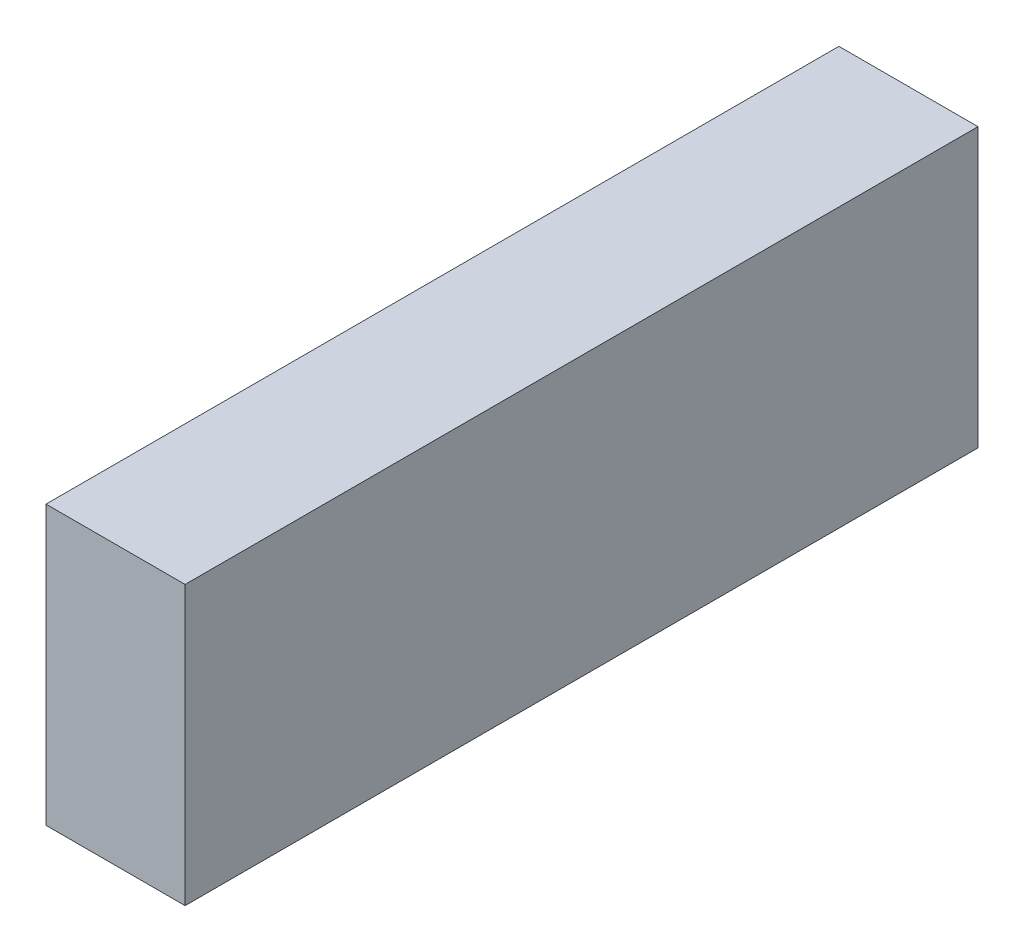
ISO-10303-21;
HEADER;
FILE_DESCRIPTION(('STEP AP214'),'2;1');
FILE_NAME('part.step','',(''),(''),'','','');
FILE_SCHEMA(('AUTOMOTIVE_DESIGN { 1 0 10303 214 1 1 1 1 }'));
ENDSEC;
DATA;
#1=APPLICATION_CONTEXT('core data for automotive mechanical design processes');
#2=APPLICATION_PROTOCOL_DEFINITION('international standard','automotive_design',2000,#1);
#3=PRODUCT_CONTEXT('',#1,'mechanical');
#4=PRODUCT('Part','Part','',(#3));
#5=PRODUCT_RELATED_PRODUCT_CATEGORY('part','',(#4));
#6=PRODUCT_DEFINITION_FORMATION('','',#4);
#7=PRODUCT_DEFINITION_CONTEXT('part definition',#1,'design');
#8=PRODUCT_DEFINITION('design','',#6,#7);
#9=PRODUCT_DEFINITION_SHAPE('','',#8);
#10=(LENGTH_UNIT() NAMED_UNIT(*) SI_UNIT(.MILLI.,.METRE.));
#11=(NAMED_UNIT(*) PLANE_ANGLE_UNIT() SI_UNIT($,.RADIAN.));
#12=(NAMED_UNIT(*) SI_UNIT($,.STERADIAN.) SOLID_ANGLE_UNIT());
#13=UNCERTAINTY_MEASURE_WITH_UNIT(LENGTH_MEASURE(1.E-05),#10,'distance_accuracy_value','');
#14=(GEOMETRIC_REPRESENTATION_CONTEXT(3) GLOBAL_UNCERTAINTY_ASSIGNED_CONTEXT((#13)) GLOBAL_UNIT_ASSIGNED_CONTEXT((#10,
#11,#12)) REPRESENTATION_CONTEXT('',''));
#15=CARTESIAN_POINT('',(0.,0.,0.));
#16=DIRECTION('',(0.,0.,1.));
#17=DIRECTION('',(1.,0.,0.));
#18=AXIS2_PLACEMENT_3D('',#15,#16,#17);
#19=CARTESIAN_POINT('',(-10.,0.,0.));
#20=DIRECTION('',(0.,0.,1.));
#21=DIRECTION('',(1.,0.,0.));
#22=AXIS2_PLACEMENT_3D('',#19,#20,#21);
#23=PLANE('',#22);
#24=DIRECTION('',(0.,-1.,0.));
#25=VECTOR('',#24,1.);
#26=CARTESIAN_POINT('',(0.,0.,0.));
#27=LINE('',#26,#25);
#28=CARTESIAN_POINT('',(0.,20.,0.));
#29=VERTEX_POINT('',#28);
#30=CARTESIAN_POINT('',(0.,0.,0.));
#31=VERTEX_POINT('',#30);
#32=EDGE_CURVE('E104',#29,#31,#27,.T.);
#33=ORIENTED_EDGE('',*,*,#32,.F.);
#34=DIRECTION('',(1.,0.,0.));
#35=VECTOR('',#34,1.);
#36=CARTESIAN_POINT('',(-10.,20.,0.));
#37=LINE('',#36,#35);
#38=CARTESIAN_POINT('',(-10.,20.,0.));
#39=VERTEX_POINT('',#38);
#40=EDGE_CURVE('E11',#39,#29,#37,.T.);
#41=ORIENTED_EDGE('',*,*,#40,.F.);
#42=DIRECTION('',(0.,-1.,0.));
#43=VECTOR('',#42,1.);
#44=CARTESIAN_POINT('',(-10.,0.,0.));
#45=LINE('',#44,#43);
#46=CARTESIAN_POINT('',(-10.,0.,0.));
#47=VERTEX_POINT('',#46);
#48=EDGE_CURVE('E100',#39,#47,#45,.T.);
#49=ORIENTED_EDGE('',*,*,#48,.T.);
#50=DIRECTION('',(1.,0.,0.));
#51=VECTOR('',#50,1.);
#52=CARTESIAN_POINT('',(-10.,0.,0.));
#53=LINE('',#52,#51);
#54=EDGE_CURVE('E45',#47,#31,#53,.T.);
#55=ORIENTED_EDGE('',*,*,#54,.T.);
#56=EDGE_LOOP('',(#33,#41,#49,#55));
#57=FACE_BOUND('',#56,.T.);
#58=ADVANCED_FACE('F39',(#57),#23,.T.);
#59=CARTESIAN_POINT('',(-10.,20.,0.));
#60=DIRECTION('',(0.,1.,0.));
#61=DIRECTION('',(0.,0.,1.));
#62=AXIS2_PLACEMENT_3D('',#59,#60,#61);
#63=PLANE('',#62);
#64=DIRECTION('',(0.,0.,1.));
#65=VECTOR('',#64,1.);
#66=CARTESIAN_POINT('',(0.,20.,0.));
#67=LINE('',#66,#65);
#68=CARTESIAN_POINT('',(0.,20.,-57.));
#69=VERTEX_POINT('',#68);
#70=EDGE_CURVE('E98',#69,#29,#67,.T.);
#71=ORIENTED_EDGE('',*,*,#70,.F.);
#72=DIRECTION('',(1.,0.,0.));
#73=VECTOR('',#72,1.);
#74=CARTESIAN_POINT('',(-10.,20.,-57.));
#75=LINE('',#74,#73);
#76=CARTESIAN_POINT('',(-10.,20.,-57.));
#77=VERTEX_POINT('',#76);
#78=EDGE_CURVE('E48',#77,#69,#75,.T.);
#79=ORIENTED_EDGE('',*,*,#78,.F.);
#80=DIRECTION('',(0.,0.,1.));
#81=VECTOR('',#80,1.);
#82=CARTESIAN_POINT('',(-10.,20.,0.));
#83=LINE('',#82,#81);
#84=EDGE_CURVE('E92',#77,#39,#83,.T.);
#85=ORIENTED_EDGE('',*,*,#84,.T.);
#86=ORIENTED_EDGE('',*,*,#40,.T.);
#87=EDGE_LOOP('',(#71,#79,#85,#86));
#88=FACE_BOUND('',#87,.T.);
#89=ADVANCED_FACE('F111',(#88),#63,.T.);
#90=CARTESIAN_POINT('',(-10.,0.,-57.));
#91=DIRECTION('',(0.,0.,-1.));
#92=DIRECTION('',(-1.,0.,0.));
#93=AXIS2_PLACEMENT_3D('',#90,#91,#92);
#94=PLANE('',#93);
#95=DIRECTION('',(0.,1.,0.));
#96=VECTOR('',#95,1.);
#97=CARTESIAN_POINT('',(0.,0.,-57.));
#98=LINE('',#97,#96);
#99=CARTESIAN_POINT('',(0.,0.,-57.));
#100=VERTEX_POINT('',#99);
#101=EDGE_CURVE('E87',#100,#69,#98,.T.);
#102=ORIENTED_EDGE('',*,*,#101,.F.);
#103=DIRECTION('',(1.,0.,0.));
#104=VECTOR('',#103,1.);
#105=CARTESIAN_POINT('',(-10.,0.,-57.));
#106=LINE('',#105,#104);
#107=CARTESIAN_POINT('',(-10.,0.,-57.));
#108=VERTEX_POINT('',#107);
#109=EDGE_CURVE('E84',#108,#100,#106,.T.);
#110=ORIENTED_EDGE('',*,*,#109,.F.);
#111=DIRECTION('',(0.,1.,0.));
#112=VECTOR('',#111,1.);
#113=CARTESIAN_POINT('',(-10.,0.,-57.));
#114=LINE('',#113,#112);
#115=EDGE_CURVE('E90',#108,#77,#114,.T.);
#116=ORIENTED_EDGE('',*,*,#115,.T.);
#117=ORIENTED_EDGE('',*,*,#78,.T.);
#118=EDGE_LOOP('',(#102,#110,#116,#117));
#119=FACE_BOUND('',#118,.T.);
#120=ADVANCED_FACE('F86',(#119),#94,.T.);
#121=CARTESIAN_POINT('',(-10.,0.,0.));
#122=DIRECTION('',(0.,-1.,0.));
#123=DIRECTION('',(0.,0.,-1.));
#124=AXIS2_PLACEMENT_3D('',#121,#122,#123);
#125=PLANE('',#124);
#126=DIRECTION('',(0.,0.,-1.));
#127=VECTOR('',#126,1.);
#128=CARTESIAN_POINT('',(0.,0.,0.));
#129=LINE('',#128,#127);
#130=EDGE_CURVE('E106',#31,#100,#129,.T.);
#131=ORIENTED_EDGE('',*,*,#130,.F.);
#132=ORIENTED_EDGE('',*,*,#54,.F.);
#133=DIRECTION('',(0.,0.,-1.));
#134=VECTOR('',#133,1.);
#135=CARTESIAN_POINT('',(-10.,0.,0.));
#136=LINE('',#135,#134);
#137=EDGE_CURVE('E93',#47,#108,#136,.T.);
#138=ORIENTED_EDGE('',*,*,#137,.T.);
#139=ORIENTED_EDGE('',*,*,#109,.T.);
#140=EDGE_LOOP('',(#131,#132,#138,#139));
#141=FACE_BOUND('',#140,.T.);
#142=ADVANCED_FACE('F96',(#141),#125,.T.);
#143=CARTESIAN_POINT('',(-10.,0.,0.));
#144=DIRECTION('',(-1.,0.,0.));
#145=DIRECTION('',(0.,0.,1.));
#146=AXIS2_PLACEMENT_3D('',#143,#144,#145);
#147=PLANE('',#146);
#148=ORIENTED_EDGE('',*,*,#48,.F.);
#149=ORIENTED_EDGE('',*,*,#84,.F.);
#150=ORIENTED_EDGE('',*,*,#115,.F.);
#151=ORIENTED_EDGE('',*,*,#137,.F.);
#152=EDGE_LOOP('',(#148,#149,#150,#151));
#153=FACE_BOUND('',#152,.T.);
#154=ADVANCED_FACE('F95',(#153),#147,.T.);
#155=CARTESIAN_POINT('',(0.,0.,0.));
#156=DIRECTION('',(-1.,0.,0.));
#157=DIRECTION('',(0.,0.,1.));
#158=AXIS2_PLACEMENT_3D('',#155,#156,#157);
#159=PLANE('',#158);
#160=ORIENTED_EDGE('',*,*,#32,.T.);
#161=ORIENTED_EDGE('',*,*,#130,.T.);
#162=ORIENTED_EDGE('',*,*,#101,.T.);
#163=ORIENTED_EDGE('',*,*,#70,.T.);
#164=EDGE_LOOP('',(#160,#161,#162,#163));
#165=FACE_BOUND('',#164,.T.);
#166=ADVANCED_FACE('F115',(#165),#159,.F.);
#167=CLOSED_SHELL('',(#58,#89,#120,#142,#154,#166));
#168=MANIFOLD_SOLID_BREP('B2',#167);
#169=ADVANCED_BREP_SHAPE_REPRESENTATION('',(#18,#168),#14);
#170=SHAPE_DEFINITION_REPRESENTATION(#9,#169);
ENDSEC;
END-ISO-10303-21;
